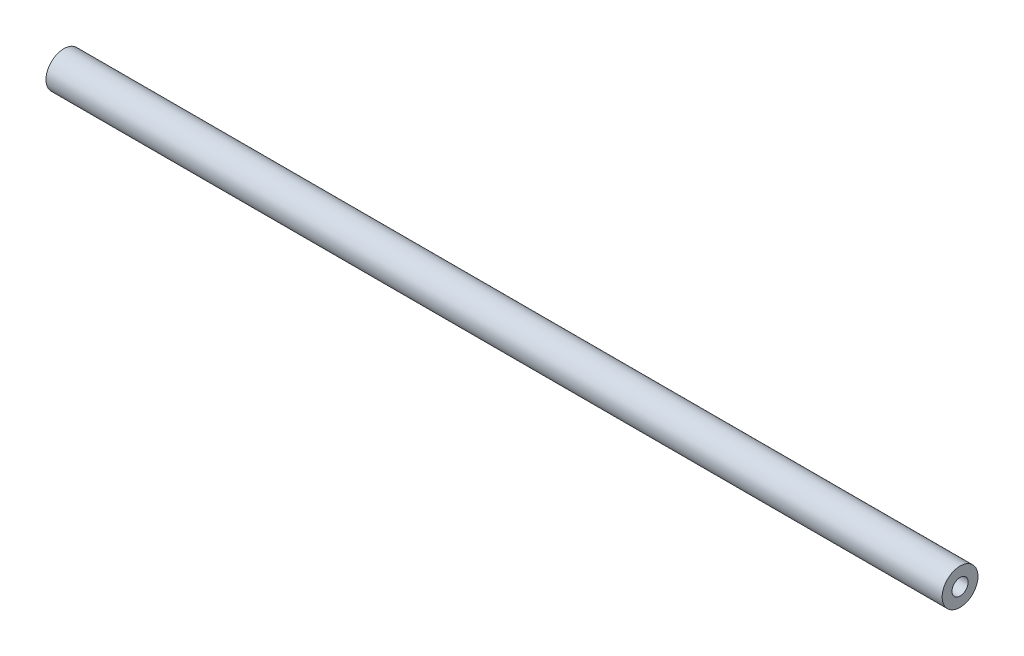
ISO-10303-21;
HEADER;
FILE_DESCRIPTION(('STEP AP214'),'2;1');
FILE_NAME('part.step','',(''),(''),'','','');
FILE_SCHEMA(('AUTOMOTIVE_DESIGN { 1 0 10303 214 1 1 1 1 }'));
ENDSEC;
DATA;
#1=APPLICATION_CONTEXT('core data for automotive mechanical design processes');
#2=APPLICATION_PROTOCOL_DEFINITION('international standard','automotive_design',2000,#1);
#3=PRODUCT_CONTEXT('',#1,'mechanical');
#4=PRODUCT('Part','Part','',(#3));
#5=PRODUCT_RELATED_PRODUCT_CATEGORY('part','',(#4));
#6=PRODUCT_DEFINITION_FORMATION('','',#4);
#7=PRODUCT_DEFINITION_CONTEXT('part definition',#1,'design');
#8=PRODUCT_DEFINITION('design','',#6,#7);
#9=PRODUCT_DEFINITION_SHAPE('','',#8);
#10=(LENGTH_UNIT() NAMED_UNIT(*) SI_UNIT(.MILLI.,.METRE.));
#11=(NAMED_UNIT(*) PLANE_ANGLE_UNIT() SI_UNIT($,.RADIAN.));
#12=(NAMED_UNIT(*) SI_UNIT($,.STERADIAN.) SOLID_ANGLE_UNIT());
#13=UNCERTAINTY_MEASURE_WITH_UNIT(LENGTH_MEASURE(1.E-05),#10,'distance_accuracy_value','');
#14=(GEOMETRIC_REPRESENTATION_CONTEXT(3) GLOBAL_UNCERTAINTY_ASSIGNED_CONTEXT((#13)) GLOBAL_UNIT_ASSIGNED_CONTEXT((#10,
#11,#12)) REPRESENTATION_CONTEXT('',''));
#15=CARTESIAN_POINT('',(0.,0.,0.));
#16=DIRECTION('',(0.,0.,1.));
#17=DIRECTION('',(1.,0.,0.));
#18=AXIS2_PLACEMENT_3D('',#15,#16,#17);
#19=CARTESIAN_POINT('',(-50.,-6.79118095489748,11.5557202337125));
#20=DIRECTION('',(1.,0.,0.));
#21=DIRECTION('',(0.,0.,-1.));
#22=AXIS2_PLACEMENT_3D('',#19,#20,#21);
#23=CYLINDRICAL_SURFACE('',#22,2.);
#24=CARTESIAN_POINT('',(0.,-6.79118095489748,11.5557202337125));
#25=DIRECTION('',(1.,0.,0.));
#26=DIRECTION('',(0.,0.,-1.));
#27=AXIS2_PLACEMENT_3D('',#24,#25,#26);
#28=CIRCLE('',#27,2.);
#29=CARTESIAN_POINT('',(0.,-6.79118095489748,9.55572023371247));
#30=VERTEX_POINT('',#29);
#31=EDGE_CURVE('E47',#30,#30,#28,.T.);
#32=ORIENTED_EDGE('',*,*,#31,.F.);
#33=EDGE_LOOP('',(#32));
#34=FACE_BOUND('',#33,.T.);
#35=CARTESIAN_POINT('',(-100.,-6.79118095489748,11.5557202337125));
#36=DIRECTION('',(1.,0.,0.));
#37=DIRECTION('',(0.,0.,-1.));
#38=AXIS2_PLACEMENT_3D('',#35,#36,#37);
#39=CIRCLE('',#38,2.);
#40=CARTESIAN_POINT('',(-100.,-6.79118095489748,9.55572023371247));
#41=VERTEX_POINT('',#40);
#42=EDGE_CURVE('E55',#41,#41,#39,.T.);
#43=ORIENTED_EDGE('',*,*,#42,.T.);
#44=EDGE_LOOP('',(#43));
#45=FACE_BOUND('',#44,.T.);
#46=ADVANCED_FACE('F41',(#34,#45),#23,.T.);
#47=CARTESIAN_POINT('',(-50.,-6.79118095489748,11.5557202337125));
#48=DIRECTION('',(1.,0.,0.));
#49=DIRECTION('',(0.,0.,-1.));
#50=AXIS2_PLACEMENT_3D('',#47,#48,#49);
#51=CYLINDRICAL_SURFACE('',#50,0.899999999999999);
#52=CARTESIAN_POINT('',(0.,-6.79118095489748,11.5557202337125));
#53=DIRECTION('',(1.,0.,0.));
#54=DIRECTION('',(0.,0.,-1.));
#55=AXIS2_PLACEMENT_3D('',#52,#53,#54);
#56=CIRCLE('',#55,0.899999999999999);
#57=CARTESIAN_POINT('',(0.,-6.79118095489748,10.6557202337125));
#58=VERTEX_POINT('',#57);
#59=EDGE_CURVE('E10',#58,#58,#56,.T.);
#60=ORIENTED_EDGE('',*,*,#59,.T.);
#61=EDGE_LOOP('',(#60));
#62=FACE_BOUND('',#61,.T.);
#63=CARTESIAN_POINT('',(-100.,-6.79118095489748,11.5557202337125));
#64=DIRECTION('',(1.,0.,0.));
#65=DIRECTION('',(0.,0.,-1.));
#66=AXIS2_PLACEMENT_3D('',#63,#64,#65);
#67=CIRCLE('',#66,0.899999999999999);
#68=CARTESIAN_POINT('',(-100.,-6.79118095489748,10.6557202337125));
#69=VERTEX_POINT('',#68);
#70=EDGE_CURVE('E51',#69,#69,#67,.T.);
#71=ORIENTED_EDGE('',*,*,#70,.F.);
#72=EDGE_LOOP('',(#71));
#73=FACE_BOUND('',#72,.T.);
#74=ADVANCED_FACE('F69',(#62,#73),#51,.F.);
#75=CARTESIAN_POINT('',(0.,0.,0.));
#76=DIRECTION('',(1.,0.,0.));
#77=DIRECTION('',(0.,0.,-1.));
#78=AXIS2_PLACEMENT_3D('',#75,#76,#77);
#79=PLANE('',#78);
#80=ORIENTED_EDGE('',*,*,#31,.T.);
#81=EDGE_LOOP('',(#80));
#82=FACE_BOUND('',#81,.T.);
#83=ORIENTED_EDGE('',*,*,#59,.F.);
#84=EDGE_LOOP('',(#83));
#85=FACE_BOUND('',#84,.T.);
#86=ADVANCED_FACE('F65',(#82,#85),#79,.T.);
#87=CARTESIAN_POINT('',(-100.,0.,0.));
#88=DIRECTION('',(-1.,0.,0.));
#89=DIRECTION('',(0.,0.,-1.));
#90=AXIS2_PLACEMENT_3D('',#87,#88,#89);
#91=PLANE('',#90);
#92=ORIENTED_EDGE('',*,*,#42,.F.);
#93=EDGE_LOOP('',(#92));
#94=FACE_BOUND('',#93,.T.);
#95=ORIENTED_EDGE('',*,*,#70,.T.);
#96=EDGE_LOOP('',(#95));
#97=FACE_BOUND('',#96,.T.);
#98=ADVANCED_FACE('F62',(#94,#97),#91,.T.);
#99=CLOSED_SHELL('',(#46,#74,#86,#98));
#100=MANIFOLD_SOLID_BREP('B2',#99);
#101=ADVANCED_BREP_SHAPE_REPRESENTATION('',(#18,#100),#14);
#102=SHAPE_DEFINITION_REPRESENTATION(#9,#101);
ENDSEC;
END-ISO-10303-21;
